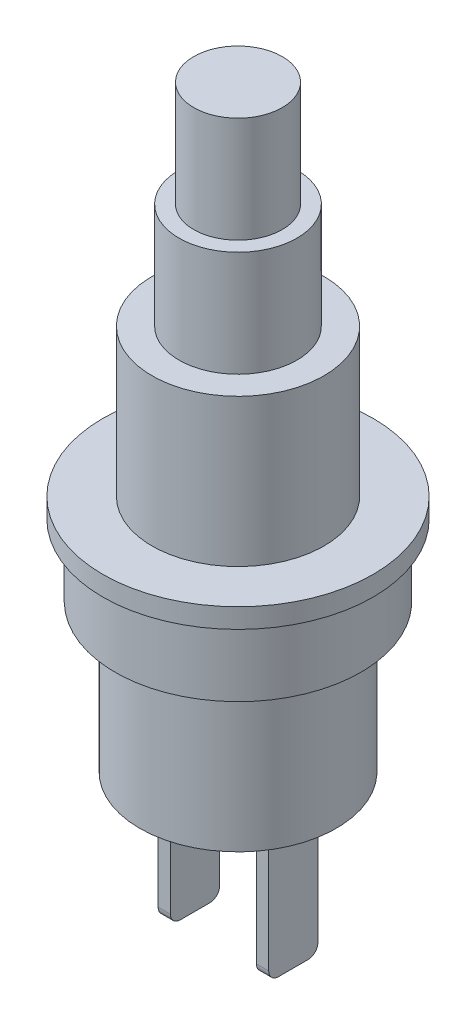
ISO-10303-21;
HEADER;
FILE_DESCRIPTION(('STEP AP214'),'2;1');
FILE_NAME('part.step','',(''),(''),'','','');
FILE_SCHEMA(('AUTOMOTIVE_DESIGN { 1 0 10303 214 1 1 1 1 }'));
ENDSEC;
DATA;
#1=APPLICATION_CONTEXT('core data for automotive mechanical design processes');
#2=APPLICATION_PROTOCOL_DEFINITION('international standard','automotive_design',2000,#1);
#3=PRODUCT_CONTEXT('',#1,'mechanical');
#4=PRODUCT('Part','Part','',(#3));
#5=PRODUCT_RELATED_PRODUCT_CATEGORY('part','',(#4));
#6=PRODUCT_DEFINITION_FORMATION('','',#4);
#7=PRODUCT_DEFINITION_CONTEXT('part definition',#1,'design');
#8=PRODUCT_DEFINITION('design','',#6,#7);
#9=PRODUCT_DEFINITION_SHAPE('','',#8);
#10=(LENGTH_UNIT() NAMED_UNIT(*) SI_UNIT(.MILLI.,.METRE.));
#11=(NAMED_UNIT(*) PLANE_ANGLE_UNIT() SI_UNIT($,.RADIAN.));
#12=(NAMED_UNIT(*) SI_UNIT($,.STERADIAN.) SOLID_ANGLE_UNIT());
#13=UNCERTAINTY_MEASURE_WITH_UNIT(LENGTH_MEASURE(1.E-05),#10,'distance_accuracy_value','');
#14=(GEOMETRIC_REPRESENTATION_CONTEXT(3) GLOBAL_UNCERTAINTY_ASSIGNED_CONTEXT((#13)) GLOBAL_UNIT_ASSIGNED_CONTEXT((#10,
#11,#12)) REPRESENTATION_CONTEXT('',''));
#15=CARTESIAN_POINT('',(0.,0.,0.));
#16=DIRECTION('',(0.,0.,1.));
#17=DIRECTION('',(1.,0.,0.));
#18=AXIS2_PLACEMENT_3D('',#15,#16,#17);
#19=CARTESIAN_POINT('',(-4.,0.,0.));
#20=DIRECTION('',(0.,1.,0.));
#21=DIRECTION('',(0.,0.,1.));
#22=AXIS2_PLACEMENT_3D('',#19,#20,#21);
#23=PLANE('',#22);
#24=DIRECTION('',(0.,0.,1.));
#25=VECTOR('',#24,1.);
#26=CARTESIAN_POINT('',(2.25,0.,-1.));
#27=LINE('',#26,#25);
#28=CARTESIAN_POINT('',(2.25,0.,-1.));
#29=VERTEX_POINT('',#28);
#30=CARTESIAN_POINT('',(2.25,0.,1.));
#31=VERTEX_POINT('',#30);
#32=EDGE_CURVE('E141',#29,#31,#27,.T.);
#33=ORIENTED_EDGE('',*,*,#32,.F.);
#34=DIRECTION('',(-1.,0.,0.));
#35=VECTOR('',#34,1.);
#36=CARTESIAN_POINT('',(2.25,0.,-1.));
#37=LINE('',#36,#35);
#38=CARTESIAN_POINT('',(1.75,0.,-1.));
#39=VERTEX_POINT('',#38);
#40=EDGE_CURVE('E136',#29,#39,#37,.T.);
#41=ORIENTED_EDGE('',*,*,#40,.T.);
#42=DIRECTION('',(0.,0.,1.));
#43=VECTOR('',#42,1.);
#44=CARTESIAN_POINT('',(1.75,0.,-1.));
#45=LINE('',#44,#43);
#46=CARTESIAN_POINT('',(1.75,0.,1.));
#47=VERTEX_POINT('',#46);
#48=EDGE_CURVE('E129',#39,#47,#45,.T.);
#49=ORIENTED_EDGE('',*,*,#48,.T.);
#50=DIRECTION('',(-1.,0.,0.));
#51=VECTOR('',#50,1.);
#52=CARTESIAN_POINT('',(2.25,0.,1.));
#53=LINE('',#52,#51);
#54=EDGE_CURVE('E133',#31,#47,#53,.T.);
#55=ORIENTED_EDGE('',*,*,#54,.F.);
#56=EDGE_LOOP('',(#33,#41,#49,#55));
#57=FACE_BOUND('',#56,.T.);
#58=CARTESIAN_POINT('',(0.,0.,0.));
#59=DIRECTION('',(0.,-1.,0.));
#60=DIRECTION('',(0.,0.,-1.));
#61=AXIS2_PLACEMENT_3D('',#58,#59,#60);
#62=CIRCLE('',#61,4.);
#63=CARTESIAN_POINT('',(0.,0.,-4.));
#64=VERTEX_POINT('',#63);
#65=EDGE_CURVE('E180',#64,#64,#62,.T.);
#66=ORIENTED_EDGE('',*,*,#65,.T.);
#67=EDGE_LOOP('',(#66));
#68=FACE_BOUND('',#67,.T.);
#69=DIRECTION('',(-1.,0.,0.));
#70=VECTOR('',#69,1.);
#71=CARTESIAN_POINT('',(-2.25,0.,-1.));
#72=LINE('',#71,#70);
#73=CARTESIAN_POINT('',(-1.75,0.,-1.));
#74=VERTEX_POINT('',#73);
#75=CARTESIAN_POINT('',(-2.25,0.,-1.));
#76=VERTEX_POINT('',#75);
#77=EDGE_CURVE('E173',#74,#76,#72,.T.);
#78=ORIENTED_EDGE('',*,*,#77,.T.);
#79=DIRECTION('',(0.,0.,1.));
#80=VECTOR('',#79,1.);
#81=CARTESIAN_POINT('',(-2.25,0.,-1.));
#82=LINE('',#81,#80);
#83=CARTESIAN_POINT('',(-2.25,0.,1.));
#84=VERTEX_POINT('',#83);
#85=EDGE_CURVE('E177',#76,#84,#82,.T.);
#86=ORIENTED_EDGE('',*,*,#85,.T.);
#87=DIRECTION('',(-1.,0.,0.));
#88=VECTOR('',#87,1.);
#89=CARTESIAN_POINT('',(-2.25,0.,1.));
#90=LINE('',#89,#88);
#91=CARTESIAN_POINT('',(-1.75,0.,1.));
#92=VERTEX_POINT('',#91);
#93=EDGE_CURVE('E167',#92,#84,#90,.T.);
#94=ORIENTED_EDGE('',*,*,#93,.F.);
#95=DIRECTION('',(0.,0.,1.));
#96=VECTOR('',#95,1.);
#97=CARTESIAN_POINT('',(-1.75,0.,-1.));
#98=LINE('',#97,#96);
#99=EDGE_CURVE('E181',#74,#92,#98,.T.);
#100=ORIENTED_EDGE('',*,*,#99,.F.);
#101=EDGE_LOOP('',(#78,#86,#94,#100));
#102=FACE_BOUND('',#101,.T.);
#103=ADVANCED_FACE('F37',(#57,#68,#102),#23,.F.);
#104=CARTESIAN_POINT('',(0.,24.3,0.));
#105=DIRECTION('',(0.,-1.,0.));
#106=DIRECTION('',(0.,0.,-1.));
#107=AXIS2_PLACEMENT_3D('',#104,#105,#106);
#108=PLANE('',#107);
#109=CARTESIAN_POINT('',(0.,24.3,0.));
#110=DIRECTION('',(0.,-1.,0.));
#111=DIRECTION('',(0.,0.,-1.));
#112=AXIS2_PLACEMENT_3D('',#109,#110,#111);
#113=CIRCLE('',#112,1.8);
#114=CARTESIAN_POINT('',(0.,24.3,-1.8));
#115=VERTEX_POINT('',#114);
#116=EDGE_CURVE('E220',#115,#115,#113,.T.);
#117=ORIENTED_EDGE('',*,*,#116,.F.);
#118=EDGE_LOOP('',(#117));
#119=FACE_BOUND('',#118,.T.);
#120=ADVANCED_FACE('F282',(#119),#108,.F.);
#121=CARTESIAN_POINT('',(0.,0.,0.));
#122=DIRECTION('',(0.,-1.,0.));
#123=DIRECTION('',(0.,0.,-1.));
#124=AXIS2_PLACEMENT_3D('',#121,#122,#123);
#125=CYLINDRICAL_SURFACE('',#124,1.8);
#126=CARTESIAN_POINT('',(0.,20.,0.));
#127=DIRECTION('',(0.,-1.,0.));
#128=DIRECTION('',(0.,0.,-1.));
#129=AXIS2_PLACEMENT_3D('',#126,#127,#128);
#130=CIRCLE('',#129,1.8);
#131=CARTESIAN_POINT('',(0.,20.,-1.8));
#132=VERTEX_POINT('',#131);
#133=EDGE_CURVE('E217',#132,#132,#130,.T.);
#134=ORIENTED_EDGE('',*,*,#133,.F.);
#135=EDGE_LOOP('',(#134));
#136=FACE_BOUND('',#135,.T.);
#137=ORIENTED_EDGE('',*,*,#116,.T.);
#138=EDGE_LOOP('',(#137));
#139=FACE_BOUND('',#138,.T.);
#140=ADVANCED_FACE('F287',(#136,#139),#125,.T.);
#141=CARTESIAN_POINT('',(-1.8,20.,0.));
#142=DIRECTION('',(0.,-1.,0.));
#143=DIRECTION('',(0.,0.,-1.));
#144=AXIS2_PLACEMENT_3D('',#141,#142,#143);
#145=PLANE('',#144);
#146=CARTESIAN_POINT('',(0.,20.,0.));
#147=DIRECTION('',(0.,-1.,0.));
#148=DIRECTION('',(0.,0.,-1.));
#149=AXIS2_PLACEMENT_3D('',#146,#147,#148);
#150=CIRCLE('',#149,2.4);
#151=CARTESIAN_POINT('',(0.,20.,-2.4));
#152=VERTEX_POINT('',#151);
#153=EDGE_CURVE('E214',#152,#152,#150,.T.);
#154=ORIENTED_EDGE('',*,*,#153,.F.);
#155=EDGE_LOOP('',(#154));
#156=FACE_BOUND('',#155,.T.);
#157=ORIENTED_EDGE('',*,*,#133,.T.);
#158=EDGE_LOOP('',(#157));
#159=FACE_BOUND('',#158,.T.);
#160=ADVANCED_FACE('F371',(#156,#159),#145,.F.);
#161=CARTESIAN_POINT('',(0.,0.,0.));
#162=DIRECTION('',(0.,-1.,0.));
#163=DIRECTION('',(0.,0.,-1.));
#164=AXIS2_PLACEMENT_3D('',#161,#162,#163);
#165=CYLINDRICAL_SURFACE('',#164,2.4);
#166=CARTESIAN_POINT('',(0.,15.7,0.));
#167=DIRECTION('',(0.,-1.,0.));
#168=DIRECTION('',(0.,0.,-1.));
#169=AXIS2_PLACEMENT_3D('',#166,#167,#168);
#170=CIRCLE('',#169,2.4);
#171=CARTESIAN_POINT('',(0.,15.7,-2.4));
#172=VERTEX_POINT('',#171);
#173=EDGE_CURVE('E211',#172,#172,#170,.T.);
#174=ORIENTED_EDGE('',*,*,#173,.F.);
#175=EDGE_LOOP('',(#174));
#176=FACE_BOUND('',#175,.T.);
#177=ORIENTED_EDGE('',*,*,#153,.T.);
#178=EDGE_LOOP('',(#177));
#179=FACE_BOUND('',#178,.T.);
#180=ADVANCED_FACE('F367',(#176,#179),#165,.T.);
#181=CARTESIAN_POINT('',(-2.4,15.7,0.));
#182=DIRECTION('',(0.,-1.,0.));
#183=DIRECTION('',(0.,0.,-1.));
#184=AXIS2_PLACEMENT_3D('',#181,#182,#183);
#185=PLANE('',#184);
#186=CARTESIAN_POINT('',(0.,15.7,0.));
#187=DIRECTION('',(0.,-1.,0.));
#188=DIRECTION('',(0.,0.,-1.));
#189=AXIS2_PLACEMENT_3D('',#186,#187,#188);
#190=CIRCLE('',#189,3.5);
#191=CARTESIAN_POINT('',(0.,15.7,-3.5));
#192=VERTEX_POINT('',#191);
#193=EDGE_CURVE('E208',#192,#192,#190,.T.);
#194=ORIENTED_EDGE('',*,*,#193,.F.);
#195=EDGE_LOOP('',(#194));
#196=FACE_BOUND('',#195,.T.);
#197=ORIENTED_EDGE('',*,*,#173,.T.);
#198=EDGE_LOOP('',(#197));
#199=FACE_BOUND('',#198,.T.);
#200=ADVANCED_FACE('F363',(#196,#199),#185,.F.);
#201=CARTESIAN_POINT('',(0.,0.,0.));
#202=DIRECTION('',(0.,-1.,0.));
#203=DIRECTION('',(0.,0.,-1.));
#204=AXIS2_PLACEMENT_3D('',#201,#202,#203);
#205=CYLINDRICAL_SURFACE('',#204,3.5);
#206=CARTESIAN_POINT('',(0.,9.7,0.));
#207=DIRECTION('',(0.,-1.,0.));
#208=DIRECTION('',(0.,0.,-1.));
#209=AXIS2_PLACEMENT_3D('',#206,#207,#208);
#210=CIRCLE('',#209,3.5);
#211=CARTESIAN_POINT('',(0.,9.7,-3.5));
#212=VERTEX_POINT('',#211);
#213=EDGE_CURVE('E205',#212,#212,#210,.T.);
#214=ORIENTED_EDGE('',*,*,#213,.F.);
#215=EDGE_LOOP('',(#214));
#216=FACE_BOUND('',#215,.T.);
#217=ORIENTED_EDGE('',*,*,#193,.T.);
#218=EDGE_LOOP('',(#217));
#219=FACE_BOUND('',#218,.T.);
#220=ADVANCED_FACE('F359',(#216,#219),#205,.T.);
#221=CARTESIAN_POINT('',(-3.5,9.7,0.));
#222=DIRECTION('',(0.,-1.,0.));
#223=DIRECTION('',(0.,0.,-1.));
#224=AXIS2_PLACEMENT_3D('',#221,#222,#223);
#225=PLANE('',#224);
#226=CARTESIAN_POINT('',(0.,9.7,0.));
#227=DIRECTION('',(0.,-1.,0.));
#228=DIRECTION('',(0.,0.,-1.));
#229=AXIS2_PLACEMENT_3D('',#226,#227,#228);
#230=CIRCLE('',#229,5.5);
#231=CARTESIAN_POINT('',(0.,9.7,-5.5));
#232=VERTEX_POINT('',#231);
#233=EDGE_CURVE('E202',#232,#232,#230,.T.);
#234=ORIENTED_EDGE('',*,*,#233,.F.);
#235=EDGE_LOOP('',(#234));
#236=FACE_BOUND('',#235,.T.);
#237=ORIENTED_EDGE('',*,*,#213,.T.);
#238=EDGE_LOOP('',(#237));
#239=FACE_BOUND('',#238,.T.);
#240=ADVANCED_FACE('F355',(#236,#239),#225,.F.);
#241=CARTESIAN_POINT('',(0.,0.,0.));
#242=DIRECTION('',(0.,-1.,0.));
#243=DIRECTION('',(0.,0.,-1.));
#244=AXIS2_PLACEMENT_3D('',#241,#242,#243);
#245=CYLINDRICAL_SURFACE('',#244,5.5);
#246=CARTESIAN_POINT('',(0.,8.9,0.));
#247=DIRECTION('',(0.,-1.,0.));
#248=DIRECTION('',(0.,0.,-1.));
#249=AXIS2_PLACEMENT_3D('',#246,#247,#248);
#250=CIRCLE('',#249,5.5);
#251=CARTESIAN_POINT('',(0.,8.9,-5.5));
#252=VERTEX_POINT('',#251);
#253=EDGE_CURVE('E199',#252,#252,#250,.T.);
#254=ORIENTED_EDGE('',*,*,#253,.F.);
#255=EDGE_LOOP('',(#254));
#256=FACE_BOUND('',#255,.T.);
#257=ORIENTED_EDGE('',*,*,#233,.T.);
#258=EDGE_LOOP('',(#257));
#259=FACE_BOUND('',#258,.T.);
#260=ADVANCED_FACE('F351',(#256,#259),#245,.T.);
#261=CARTESIAN_POINT('',(-5.5,8.9,0.));
#262=DIRECTION('',(0.,1.,0.));
#263=DIRECTION('',(0.,0.,1.));
#264=AXIS2_PLACEMENT_3D('',#261,#262,#263);
#265=PLANE('',#264);
#266=CARTESIAN_POINT('',(0.,8.9,0.));
#267=DIRECTION('',(0.,-1.,0.));
#268=DIRECTION('',(0.,0.,-1.));
#269=AXIS2_PLACEMENT_3D('',#266,#267,#268);
#270=CIRCLE('',#269,5.);
#271=CARTESIAN_POINT('',(0.,8.9,-5.));
#272=VERTEX_POINT('',#271);
#273=EDGE_CURVE('E196',#272,#272,#270,.T.);
#274=ORIENTED_EDGE('',*,*,#273,.F.);
#275=EDGE_LOOP('',(#274));
#276=FACE_BOUND('',#275,.T.);
#277=ORIENTED_EDGE('',*,*,#253,.T.);
#278=EDGE_LOOP('',(#277));
#279=FACE_BOUND('',#278,.T.);
#280=ADVANCED_FACE('F347',(#276,#279),#265,.F.);
#281=CARTESIAN_POINT('',(0.,0.,0.));
#282=DIRECTION('',(0.,-1.,0.));
#283=DIRECTION('',(0.,0.,-1.));
#284=AXIS2_PLACEMENT_3D('',#281,#282,#283);
#285=CYLINDRICAL_SURFACE('',#284,5.);
#286=CARTESIAN_POINT('',(0.,6.,0.));
#287=DIRECTION('',(0.,-1.,0.));
#288=DIRECTION('',(0.,0.,-1.));
#289=AXIS2_PLACEMENT_3D('',#286,#287,#288);
#290=CIRCLE('',#289,5.);
#291=CARTESIAN_POINT('',(0.,6.,-5.));
#292=VERTEX_POINT('',#291);
#293=EDGE_CURVE('E193',#292,#292,#290,.T.);
#294=ORIENTED_EDGE('',*,*,#293,.F.);
#295=EDGE_LOOP('',(#294));
#296=FACE_BOUND('',#295,.T.);
#297=ORIENTED_EDGE('',*,*,#273,.T.);
#298=EDGE_LOOP('',(#297));
#299=FACE_BOUND('',#298,.T.);
#300=ADVANCED_FACE('F343',(#296,#299),#285,.T.);
#301=CARTESIAN_POINT('',(-5.,6.,0.));
#302=DIRECTION('',(0.,1.,0.));
#303=DIRECTION('',(0.,0.,1.));
#304=AXIS2_PLACEMENT_3D('',#301,#302,#303);
#305=PLANE('',#304);
#306=CARTESIAN_POINT('',(0.,6.,0.));
#307=DIRECTION('',(0.,-1.,0.));
#308=DIRECTION('',(0.,0.,-1.));
#309=AXIS2_PLACEMENT_3D('',#306,#307,#308);
#310=CIRCLE('',#309,4.);
#311=CARTESIAN_POINT('',(0.,6.,-4.));
#312=VERTEX_POINT('',#311);
#313=EDGE_CURVE('E190',#312,#312,#310,.T.);
#314=ORIENTED_EDGE('',*,*,#313,.F.);
#315=EDGE_LOOP('',(#314));
#316=FACE_BOUND('',#315,.T.);
#317=ORIENTED_EDGE('',*,*,#293,.T.);
#318=EDGE_LOOP('',(#317));
#319=FACE_BOUND('',#318,.T.);
#320=ADVANCED_FACE('F339',(#316,#319),#305,.F.);
#321=CARTESIAN_POINT('',(0.,0.,0.));
#322=DIRECTION('',(0.,-1.,0.));
#323=DIRECTION('',(0.,0.,-1.));
#324=AXIS2_PLACEMENT_3D('',#321,#322,#323);
#325=CYLINDRICAL_SURFACE('',#324,4.);
#326=ORIENTED_EDGE('',*,*,#65,.F.);
#327=EDGE_LOOP('',(#326));
#328=FACE_BOUND('',#327,.T.);
#329=ORIENTED_EDGE('',*,*,#313,.T.);
#330=EDGE_LOOP('',(#329));
#331=FACE_BOUND('',#330,.T.);
#332=ADVANCED_FACE('F336',(#328,#331),#325,.T.);
#333=CARTESIAN_POINT('',(-2.25,0.,-1.));
#334=DIRECTION('',(-1.,0.,0.));
#335=DIRECTION('',(0.,-1.,0.));
#336=AXIS2_PLACEMENT_3D('',#333,#334,#335);
#337=PLANE('',#336);
#338=DIRECTION('',(0.,-1.,0.));
#339=VECTOR('',#338,1.);
#340=CARTESIAN_POINT('',(-2.25,0.,-1.));
#341=LINE('',#340,#339);
#342=CARTESIAN_POINT('',(-2.25,-5.4,-1.));
#343=VERTEX_POINT('',#342);
#344=EDGE_CURVE('E169',#76,#343,#341,.T.);
#345=ORIENTED_EDGE('',*,*,#344,.T.);
#346=CARTESIAN_POINT('',(-2.25,-5.4,-0.6));
#347=DIRECTION('',(-1.,0.,0.));
#348=DIRECTION('',(0.,-1.,0.));
#349=AXIS2_PLACEMENT_3D('',#346,#347,#348);
#350=CIRCLE('',#349,0.4);
#351=CARTESIAN_POINT('',(-2.25,-5.8,-0.6));
#352=VERTEX_POINT('',#351);
#353=EDGE_CURVE('E248',#343,#352,#350,.T.);
#354=ORIENTED_EDGE('',*,*,#353,.T.);
#355=DIRECTION('',(0.,0.,1.));
#356=VECTOR('',#355,1.);
#357=CARTESIAN_POINT('',(-2.25,-5.8,-1.));
#358=LINE('',#357,#356);
#359=CARTESIAN_POINT('',(-2.25,-5.8,0.6));
#360=VERTEX_POINT('',#359);
#361=EDGE_CURVE('E176',#352,#360,#358,.T.);
#362=ORIENTED_EDGE('',*,*,#361,.T.);
#363=CARTESIAN_POINT('',(-2.25,-5.4,0.6));
#364=DIRECTION('',(-1.,0.,0.));
#365=DIRECTION('',(0.,-1.,0.));
#366=AXIS2_PLACEMENT_3D('',#363,#364,#365);
#367=CIRCLE('',#366,0.4);
#368=CARTESIAN_POINT('',(-2.25,-5.4,1.));
#369=VERTEX_POINT('',#368);
#370=EDGE_CURVE('E52',#360,#369,#367,.T.);
#371=ORIENTED_EDGE('',*,*,#370,.T.);
#372=DIRECTION('',(0.,-1.,0.));
#373=VECTOR('',#372,1.);
#374=CARTESIAN_POINT('',(-2.25,0.,1.));
#375=LINE('',#374,#373);
#376=EDGE_CURVE('E163',#84,#369,#375,.T.);
#377=ORIENTED_EDGE('',*,*,#376,.F.);
#378=ORIENTED_EDGE('',*,*,#85,.F.);
#379=EDGE_LOOP('',(#345,#354,#362,#371,#377,#378));
#380=FACE_BOUND('',#379,.T.);
#381=ADVANCED_FACE('F262',(#380),#337,.T.);
#382=CARTESIAN_POINT('',(-1.75,0.,-1.));
#383=DIRECTION('',(1.,0.,0.));
#384=DIRECTION('',(0.,1.,0.));
#385=AXIS2_PLACEMENT_3D('',#382,#383,#384);
#386=PLANE('',#385);
#387=DIRECTION('',(0.,0.,1.));
#388=VECTOR('',#387,1.);
#389=CARTESIAN_POINT('',(-1.75,-5.8,-1.));
#390=LINE('',#389,#388);
#391=CARTESIAN_POINT('',(-1.75,-5.8,-0.6));
#392=VERTEX_POINT('',#391);
#393=CARTESIAN_POINT('',(-1.75,-5.8,0.6));
#394=VERTEX_POINT('',#393);
#395=EDGE_CURVE('E184',#392,#394,#390,.T.);
#396=ORIENTED_EDGE('',*,*,#395,.F.);
#397=CARTESIAN_POINT('',(-1.75,-5.4,-0.6));
#398=DIRECTION('',(1.,0.,0.));
#399=DIRECTION('',(0.,1.,0.));
#400=AXIS2_PLACEMENT_3D('',#397,#398,#399);
#401=CIRCLE('',#400,0.4);
#402=CARTESIAN_POINT('',(-1.75,-5.4,-1.));
#403=VERTEX_POINT('',#402);
#404=EDGE_CURVE('E244',#392,#403,#401,.T.);
#405=ORIENTED_EDGE('',*,*,#404,.T.);
#406=DIRECTION('',(0.,1.,0.));
#407=VECTOR('',#406,1.);
#408=CARTESIAN_POINT('',(-1.75,0.,-1.));
#409=LINE('',#408,#407);
#410=EDGE_CURVE('E171',#403,#74,#409,.T.);
#411=ORIENTED_EDGE('',*,*,#410,.T.);
#412=ORIENTED_EDGE('',*,*,#99,.T.);
#413=DIRECTION('',(0.,1.,0.));
#414=VECTOR('',#413,1.);
#415=CARTESIAN_POINT('',(-1.75,0.,1.));
#416=LINE('',#415,#414);
#417=CARTESIAN_POINT('',(-1.75,-5.4,1.));
#418=VERTEX_POINT('',#417);
#419=EDGE_CURVE('E165',#418,#92,#416,.T.);
#420=ORIENTED_EDGE('',*,*,#419,.F.);
#421=CARTESIAN_POINT('',(-1.75,-5.4,0.6));
#422=DIRECTION('',(1.,0.,0.));
#423=DIRECTION('',(0.,1.,0.));
#424=AXIS2_PLACEMENT_3D('',#421,#422,#423);
#425=CIRCLE('',#424,0.4);
#426=EDGE_CURVE('E242',#418,#394,#425,.T.);
#427=ORIENTED_EDGE('',*,*,#426,.T.);
#428=EDGE_LOOP('',(#396,#405,#411,#412,#420,#427));
#429=FACE_BOUND('',#428,.T.);
#430=ADVANCED_FACE('F257',(#429),#386,.T.);
#431=CARTESIAN_POINT('',(-2.25,-5.8,-1.));
#432=DIRECTION('',(0.,-1.,0.));
#433=DIRECTION('',(1.,0.,0.));
#434=AXIS2_PLACEMENT_3D('',#431,#432,#433);
#435=PLANE('',#434);
#436=ORIENTED_EDGE('',*,*,#361,.F.);
#437=DIRECTION('',(1.,0.,0.));
#438=VECTOR('',#437,1.);
#439=CARTESIAN_POINT('',(-1.75,-5.8,-0.6));
#440=LINE('',#439,#438);
#441=EDGE_CURVE('E239',#352,#392,#440,.T.);
#442=ORIENTED_EDGE('',*,*,#441,.T.);
#443=ORIENTED_EDGE('',*,*,#395,.T.);
#444=DIRECTION('',(1.,0.,0.));
#445=VECTOR('',#444,1.);
#446=CARTESIAN_POINT('',(-2.25,-5.8,0.6));
#447=LINE('',#446,#445);
#448=EDGE_CURVE('E237',#394,#360,#447,.F.);
#449=ORIENTED_EDGE('',*,*,#448,.T.);
#450=EDGE_LOOP('',(#436,#442,#443,#449));
#451=FACE_BOUND('',#450,.T.);
#452=ADVANCED_FACE('F270',(#451),#435,.T.);
#453=CARTESIAN_POINT('',(0.,0.,-1.));
#454=DIRECTION('',(0.,0.,1.));
#455=DIRECTION('',(1.,0.,0.));
#456=AXIS2_PLACEMENT_3D('',#453,#454,#455);
#457=PLANE('',#456);
#458=ORIENTED_EDGE('',*,*,#410,.F.);
#459=DIRECTION('',(1.,0.,0.));
#460=VECTOR('',#459,1.);
#461=CARTESIAN_POINT('',(-2.25,-5.4,-1.));
#462=LINE('',#461,#460);
#463=EDGE_CURVE('E60',#403,#343,#462,.F.);
#464=ORIENTED_EDGE('',*,*,#463,.T.);
#465=ORIENTED_EDGE('',*,*,#344,.F.);
#466=ORIENTED_EDGE('',*,*,#77,.F.);
#467=EDGE_LOOP('',(#458,#464,#465,#466));
#468=FACE_BOUND('',#467,.T.);
#469=ADVANCED_FACE('F264',(#468),#457,.F.);
#470=CARTESIAN_POINT('',(0.,0.,1.));
#471=DIRECTION('',(0.,0.,1.));
#472=DIRECTION('',(1.,0.,0.));
#473=AXIS2_PLACEMENT_3D('',#470,#471,#472);
#474=PLANE('',#473);
#475=ORIENTED_EDGE('',*,*,#376,.T.);
#476=DIRECTION('',(1.,0.,0.));
#477=VECTOR('',#476,1.);
#478=CARTESIAN_POINT('',(0.,-5.4,1.));
#479=LINE('',#478,#477);
#480=EDGE_CURVE('E45',#369,#418,#479,.T.);
#481=ORIENTED_EDGE('',*,*,#480,.T.);
#482=ORIENTED_EDGE('',*,*,#419,.T.);
#483=ORIENTED_EDGE('',*,*,#93,.T.);
#484=EDGE_LOOP('',(#475,#481,#482,#483));
#485=FACE_BOUND('',#484,.T.);
#486=ADVANCED_FACE('F253',(#485),#474,.T.);
#487=CARTESIAN_POINT('',(2.25,0.,-1.));
#488=DIRECTION('',(1.,0.,0.));
#489=DIRECTION('',(0.,1.,0.));
#490=AXIS2_PLACEMENT_3D('',#487,#488,#489);
#491=PLANE('',#490);
#492=DIRECTION('',(0.,1.,0.));
#493=VECTOR('',#492,1.);
#494=CARTESIAN_POINT('',(2.25,0.,1.));
#495=LINE('',#494,#493);
#496=CARTESIAN_POINT('',(2.25,-5.4,1.));
#497=VERTEX_POINT('',#496);
#498=EDGE_CURVE('E151',#497,#31,#495,.T.);
#499=ORIENTED_EDGE('',*,*,#498,.F.);
#500=CARTESIAN_POINT('',(2.25,-5.4,0.6));
#501=DIRECTION('',(1.,0.,0.));
#502=DIRECTION('',(0.,1.,0.));
#503=AXIS2_PLACEMENT_3D('',#500,#501,#502);
#504=CIRCLE('',#503,0.4);
#505=CARTESIAN_POINT('',(2.25,-5.8,0.6));
#506=VERTEX_POINT('',#505);
#507=EDGE_CURVE('E227',#497,#506,#504,.T.);
#508=ORIENTED_EDGE('',*,*,#507,.T.);
#509=DIRECTION('',(0.,0.,1.));
#510=VECTOR('',#509,1.);
#511=CARTESIAN_POINT('',(2.25,-5.8,-1.));
#512=LINE('',#511,#510);
#513=CARTESIAN_POINT('',(2.25,-5.8,-0.6));
#514=VERTEX_POINT('',#513);
#515=EDGE_CURVE('E310',#514,#506,#512,.T.);
#516=ORIENTED_EDGE('',*,*,#515,.F.);
#517=CARTESIAN_POINT('',(2.25,-5.4,-0.6));
#518=DIRECTION('',(1.,0.,0.));
#519=DIRECTION('',(0.,1.,0.));
#520=AXIS2_PLACEMENT_3D('',#517,#518,#519);
#521=CIRCLE('',#520,0.4);
#522=CARTESIAN_POINT('',(2.25,-5.4,-1.));
#523=VERTEX_POINT('',#522);
#524=EDGE_CURVE('E225',#514,#523,#521,.T.);
#525=ORIENTED_EDGE('',*,*,#524,.T.);
#526=DIRECTION('',(0.,1.,0.));
#527=VECTOR('',#526,1.);
#528=CARTESIAN_POINT('',(2.25,0.,-1.));
#529=LINE('',#528,#527);
#530=EDGE_CURVE('E157',#523,#29,#529,.T.);
#531=ORIENTED_EDGE('',*,*,#530,.T.);
#532=ORIENTED_EDGE('',*,*,#32,.T.);
#533=EDGE_LOOP('',(#499,#508,#516,#525,#531,#532));
#534=FACE_BOUND('',#533,.T.);
#535=ADVANCED_FACE('F301',(#534),#491,.T.);
#536=CARTESIAN_POINT('',(2.25,-5.8,-1.));
#537=DIRECTION('',(0.,-1.,0.));
#538=DIRECTION('',(1.,0.,0.));
#539=AXIS2_PLACEMENT_3D('',#536,#537,#538);
#540=PLANE('',#539);
#541=ORIENTED_EDGE('',*,*,#515,.T.);
#542=DIRECTION('',(1.,0.,0.));
#543=VECTOR('',#542,1.);
#544=CARTESIAN_POINT('',(1.75,-5.8,0.6));
#545=LINE('',#544,#543);
#546=CARTESIAN_POINT('',(1.75,-5.8,0.6));
#547=VERTEX_POINT('',#546);
#548=EDGE_CURVE('E232',#506,#547,#545,.F.);
#549=ORIENTED_EDGE('',*,*,#548,.T.);
#550=DIRECTION('',(0.,0.,1.));
#551=VECTOR('',#550,1.);
#552=CARTESIAN_POINT('',(1.75,-5.8,-1.));
#553=LINE('',#552,#551);
#554=CARTESIAN_POINT('',(1.75,-5.8,-0.6));
#555=VERTEX_POINT('',#554);
#556=EDGE_CURVE('E142',#555,#547,#553,.T.);
#557=ORIENTED_EDGE('',*,*,#556,.F.);
#558=DIRECTION('',(1.,0.,0.));
#559=VECTOR('',#558,1.);
#560=CARTESIAN_POINT('',(2.25,-5.8,-0.6));
#561=LINE('',#560,#559);
#562=EDGE_CURVE('E229',#555,#514,#561,.T.);
#563=ORIENTED_EDGE('',*,*,#562,.T.);
#564=EDGE_LOOP('',(#541,#549,#557,#563));
#565=FACE_BOUND('',#564,.T.);
#566=ADVANCED_FACE('F312',(#565),#540,.T.);
#567=CARTESIAN_POINT('',(1.75,0.,-1.));
#568=DIRECTION('',(-1.,0.,0.));
#569=DIRECTION('',(0.,-1.,0.));
#570=AXIS2_PLACEMENT_3D('',#567,#568,#569);
#571=PLANE('',#570);
#572=ORIENTED_EDGE('',*,*,#556,.T.);
#573=CARTESIAN_POINT('',(1.75,-5.4,0.6));
#574=DIRECTION('',(-1.,0.,0.));
#575=DIRECTION('',(0.,-1.,0.));
#576=AXIS2_PLACEMENT_3D('',#573,#574,#575);
#577=CIRCLE('',#576,0.4);
#578=CARTESIAN_POINT('',(1.75,-5.4,1.));
#579=VERTEX_POINT('',#578);
#580=EDGE_CURVE('E156',#547,#579,#577,.T.);
#581=ORIENTED_EDGE('',*,*,#580,.T.);
#582=DIRECTION('',(0.,-1.,0.));
#583=VECTOR('',#582,1.);
#584=CARTESIAN_POINT('',(1.75,0.,1.));
#585=LINE('',#584,#583);
#586=EDGE_CURVE('E148',#47,#579,#585,.T.);
#587=ORIENTED_EDGE('',*,*,#586,.F.);
#588=ORIENTED_EDGE('',*,*,#48,.F.);
#589=DIRECTION('',(0.,-1.,0.));
#590=VECTOR('',#589,1.);
#591=CARTESIAN_POINT('',(1.75,0.,-1.));
#592=LINE('',#591,#590);
#593=CARTESIAN_POINT('',(1.75,-5.4,-1.));
#594=VERTEX_POINT('',#593);
#595=EDGE_CURVE('E305',#39,#594,#592,.T.);
#596=ORIENTED_EDGE('',*,*,#595,.T.);
#597=CARTESIAN_POINT('',(1.75,-5.4,-0.6));
#598=DIRECTION('',(-1.,0.,0.));
#599=DIRECTION('',(0.,-1.,0.));
#600=AXIS2_PLACEMENT_3D('',#597,#598,#599);
#601=CIRCLE('',#600,0.4);
#602=EDGE_CURVE('E234',#594,#555,#601,.T.);
#603=ORIENTED_EDGE('',*,*,#602,.T.);
#604=EDGE_LOOP('',(#572,#581,#587,#588,#596,#603));
#605=FACE_BOUND('',#604,.T.);
#606=ADVANCED_FACE('F154',(#605),#571,.T.);
#607=CARTESIAN_POINT('',(0.,0.,-1.));
#608=DIRECTION('',(0.,0.,-1.));
#609=DIRECTION('',(-1.,0.,0.));
#610=AXIS2_PLACEMENT_3D('',#607,#608,#609);
#611=PLANE('',#610);
#612=ORIENTED_EDGE('',*,*,#530,.F.);
#613=DIRECTION('',(1.,0.,0.));
#614=VECTOR('',#613,1.);
#615=CARTESIAN_POINT('',(0.,-5.4,-1.));
#616=LINE('',#615,#614);
#617=EDGE_CURVE('E11',#523,#594,#616,.F.);
#618=ORIENTED_EDGE('',*,*,#617,.T.);
#619=ORIENTED_EDGE('',*,*,#595,.F.);
#620=ORIENTED_EDGE('',*,*,#40,.F.);
#621=EDGE_LOOP('',(#612,#618,#619,#620));
#622=FACE_BOUND('',#621,.T.);
#623=ADVANCED_FACE('F297',(#622),#611,.T.);
#624=CARTESIAN_POINT('',(0.,0.,1.));
#625=DIRECTION('',(0.,0.,-1.));
#626=DIRECTION('',(-1.,0.,0.));
#627=AXIS2_PLACEMENT_3D('',#624,#625,#626);
#628=PLANE('',#627);
#629=ORIENTED_EDGE('',*,*,#586,.T.);
#630=DIRECTION('',(1.,0.,0.));
#631=VECTOR('',#630,1.);
#632=CARTESIAN_POINT('',(2.25,-5.4,1.));
#633=LINE('',#632,#631);
#634=EDGE_CURVE('E223',#579,#497,#633,.T.);
#635=ORIENTED_EDGE('',*,*,#634,.T.);
#636=ORIENTED_EDGE('',*,*,#498,.T.);
#637=ORIENTED_EDGE('',*,*,#54,.T.);
#638=EDGE_LOOP('',(#629,#635,#636,#637));
#639=FACE_BOUND('',#638,.T.);
#640=ADVANCED_FACE('F146',(#639),#628,.F.);
#641=CARTESIAN_POINT('',(0.,-5.4,0.6));
#642=DIRECTION('',(-1.,0.,0.));
#643=DIRECTION('',(0.,-1.,0.));
#644=AXIS2_PLACEMENT_3D('',#641,#642,#643);
#645=CYLINDRICAL_SURFACE('',#644,0.4);
#646=ORIENTED_EDGE('',*,*,#580,.F.);
#647=ORIENTED_EDGE('',*,*,#548,.F.);
#648=ORIENTED_EDGE('',*,*,#507,.F.);
#649=ORIENTED_EDGE('',*,*,#634,.F.);
#650=EDGE_LOOP('',(#646,#647,#648,#649));
#651=FACE_BOUND('',#650,.T.);
#652=ADVANCED_FACE('F279',(#651),#645,.T.);
#653=CARTESIAN_POINT('',(-2.25,-5.4,-0.6));
#654=DIRECTION('',(-1.,0.,0.));
#655=DIRECTION('',(0.,-1.,0.));
#656=AXIS2_PLACEMENT_3D('',#653,#654,#655);
#657=CYLINDRICAL_SURFACE('',#656,0.4);
#658=ORIENTED_EDGE('',*,*,#353,.F.);
#659=ORIENTED_EDGE('',*,*,#463,.F.);
#660=ORIENTED_EDGE('',*,*,#404,.F.);
#661=ORIENTED_EDGE('',*,*,#441,.F.);
#662=EDGE_LOOP('',(#658,#659,#660,#661));
#663=FACE_BOUND('',#662,.T.);
#664=ADVANCED_FACE('F266',(#663),#657,.T.);
#665=CARTESIAN_POINT('',(0.,-5.4,0.6));
#666=DIRECTION('',(1.,0.,0.));
#667=DIRECTION('',(0.,1.,0.));
#668=AXIS2_PLACEMENT_3D('',#665,#666,#667);
#669=CYLINDRICAL_SURFACE('',#668,0.4);
#670=ORIENTED_EDGE('',*,*,#370,.F.);
#671=ORIENTED_EDGE('',*,*,#448,.F.);
#672=ORIENTED_EDGE('',*,*,#426,.F.);
#673=ORIENTED_EDGE('',*,*,#480,.F.);
#674=EDGE_LOOP('',(#670,#671,#672,#673));
#675=FACE_BOUND('',#674,.T.);
#676=ADVANCED_FACE('F272',(#675),#669,.T.);
#677=CARTESIAN_POINT('',(2.25,-5.4,-0.6));
#678=DIRECTION('',(1.,0.,0.));
#679=DIRECTION('',(0.,1.,0.));
#680=AXIS2_PLACEMENT_3D('',#677,#678,#679);
#681=CYLINDRICAL_SURFACE('',#680,0.4);
#682=ORIENTED_EDGE('',*,*,#602,.F.);
#683=ORIENTED_EDGE('',*,*,#617,.F.);
#684=ORIENTED_EDGE('',*,*,#524,.F.);
#685=ORIENTED_EDGE('',*,*,#562,.F.);
#686=EDGE_LOOP('',(#682,#683,#684,#685));
#687=FACE_BOUND('',#686,.T.);
#688=ADVANCED_FACE('F39',(#687),#681,.T.);
#689=CLOSED_SHELL('',(#103,#120,#140,#160,#180,#200,#220,#240,#260,#280,#300,#320,#332,#381,
#430,#452,#469,#486,#535,#566,#606,#623,#640,#652,#664,#676,#688));
#690=MANIFOLD_SOLID_BREP('B2',#689);
#691=ADVANCED_BREP_SHAPE_REPRESENTATION('',(#18,#690),#14);
#692=SHAPE_DEFINITION_REPRESENTATION(#9,#691);
ENDSEC;
END-ISO-10303-21;
